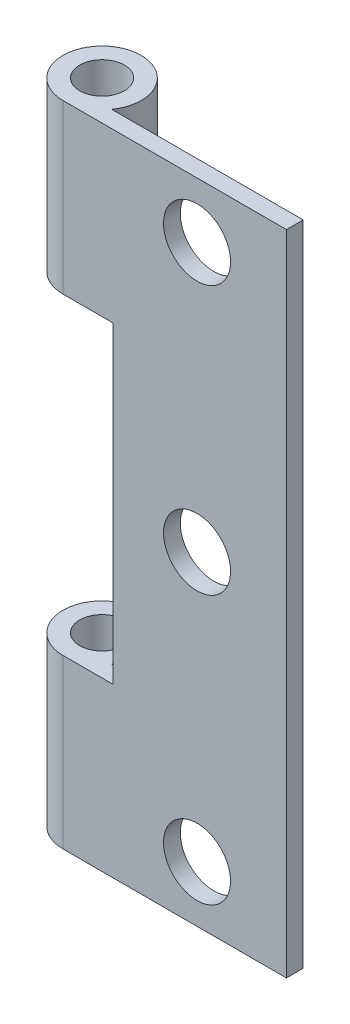
ISO-10303-21;
HEADER;
FILE_DESCRIPTION(('STEP AP214'),'2;1');
FILE_NAME('part.step','',(''),(''),'','','');
FILE_SCHEMA(('AUTOMOTIVE_DESIGN { 1 0 10303 214 1 1 1 1 }'));
ENDSEC;
DATA;
#1=APPLICATION_CONTEXT('core data for automotive mechanical design processes');
#2=APPLICATION_PROTOCOL_DEFINITION('international standard','automotive_design',2000,#1);
#3=PRODUCT_CONTEXT('',#1,'mechanical');
#4=PRODUCT('Part','Part','',(#3));
#5=PRODUCT_RELATED_PRODUCT_CATEGORY('part','',(#4));
#6=PRODUCT_DEFINITION_FORMATION('','',#4);
#7=PRODUCT_DEFINITION_CONTEXT('part definition',#1,'design');
#8=PRODUCT_DEFINITION('design','',#6,#7);
#9=PRODUCT_DEFINITION_SHAPE('','',#8);
#10=(LENGTH_UNIT() NAMED_UNIT(*) SI_UNIT(.MILLI.,.METRE.));
#11=(NAMED_UNIT(*) PLANE_ANGLE_UNIT() SI_UNIT($,.RADIAN.));
#12=(NAMED_UNIT(*) SI_UNIT($,.STERADIAN.) SOLID_ANGLE_UNIT());
#13=UNCERTAINTY_MEASURE_WITH_UNIT(LENGTH_MEASURE(1.E-05),#10,'distance_accuracy_value','');
#14=(GEOMETRIC_REPRESENTATION_CONTEXT(3) GLOBAL_UNCERTAINTY_ASSIGNED_CONTEXT((#13)) GLOBAL_UNIT_ASSIGNED_CONTEXT((#10,
#11,#12)) REPRESENTATION_CONTEXT('',''));
#15=CARTESIAN_POINT('',(0.,0.,0.));
#16=DIRECTION('',(0.,0.,1.));
#17=DIRECTION('',(1.,0.,0.));
#18=AXIS2_PLACEMENT_3D('',#15,#16,#17);
#19=CARTESIAN_POINT('',(-7.9375,23.01875,-2.1828125));
#20=DIRECTION('',(0.,-1.,0.));
#21=DIRECTION('',(0.,0.,-1.));
#22=AXIS2_PLACEMENT_3D('',#19,#20,#21);
#23=CYLINDRICAL_SURFACE('',#22,2.778125);
#24=DIRECTION('',(0.,-1.,0.));
#25=VECTOR('',#24,1.);
#26=CARTESIAN_POINT('',(-5.65762669965522,23.01875,-0.5953125));
#27=LINE('',#26,#25);
#28=CARTESIAN_POINT('',(-5.65762669965522,11.1125,-0.595312499999999));
#29=VERTEX_POINT('',#28);
#30=CARTESIAN_POINT('',(-5.65762669965522,23.01875,-0.5953125));
#31=VERTEX_POINT('',#30);
#32=EDGE_CURVE('E41',#29,#31,#27,.F.);
#33=ORIENTED_EDGE('',*,*,#32,.F.);
#34=CARTESIAN_POINT('',(-7.9375,11.1125,-2.1828125));
#35=DIRECTION('',(0.,1.,0.));
#36=DIRECTION('',(0.,0.,1.));
#37=AXIS2_PLACEMENT_3D('',#34,#35,#36);
#38=CIRCLE('',#37,2.778125);
#39=CARTESIAN_POINT('',(-7.9375,11.1125,0.5953125));
#40=VERTEX_POINT('',#39);
#41=EDGE_CURVE('E49',#29,#40,#38,.T.);
#42=ORIENTED_EDGE('',*,*,#41,.T.);
#43=DIRECTION('',(0.,-1.,0.));
#44=VECTOR('',#43,1.);
#45=CARTESIAN_POINT('',(-7.9375,-23.01875,0.5953125));
#46=LINE('',#45,#44);
#47=CARTESIAN_POINT('',(-7.9375,23.01875,0.595312500000001));
#48=VERTEX_POINT('',#47);
#49=EDGE_CURVE('E121',#48,#40,#46,.T.);
#50=ORIENTED_EDGE('',*,*,#49,.F.);
#51=CARTESIAN_POINT('',(-7.9375,23.01875,-2.1828125));
#52=DIRECTION('',(0.,1.,0.));
#53=DIRECTION('',(0.,0.,1.));
#54=AXIS2_PLACEMENT_3D('',#51,#52,#53);
#55=CIRCLE('',#54,2.778125);
#56=EDGE_CURVE('E144',#31,#48,#55,.T.);
#57=ORIENTED_EDGE('',*,*,#56,.F.);
#58=EDGE_LOOP('',(#33,#42,#50,#57));
#59=FACE_BOUND('',#58,.T.);
#60=ADVANCED_FACE('F32',(#59),#23,.T.);
#61=CARTESIAN_POINT('',(-7.9375,23.01875,-2.1828125));
#62=DIRECTION('',(0.,-1.,0.));
#63=DIRECTION('',(0.,0.,-1.));
#64=AXIS2_PLACEMENT_3D('',#61,#62,#63);
#65=CYLINDRICAL_SURFACE('',#64,1.5875);
#66=CARTESIAN_POINT('',(-7.9375,-11.1125,-2.1828125));
#67=DIRECTION('',(0.,-1.,0.));
#68=DIRECTION('',(0.,0.,-1.));
#69=AXIS2_PLACEMENT_3D('',#66,#67,#68);
#70=CIRCLE('',#69,1.5875);
#71=CARTESIAN_POINT('',(-7.9375,-11.1125,-3.7703125));
#72=VERTEX_POINT('',#71);
#73=EDGE_CURVE('E36',#72,#72,#70,.T.);
#74=ORIENTED_EDGE('',*,*,#73,.F.);
#75=EDGE_LOOP('',(#74));
#76=FACE_BOUND('',#75,.T.);
#77=CARTESIAN_POINT('',(-7.9375,-23.01875,-2.1828125));
#78=DIRECTION('',(0.,1.,0.));
#79=DIRECTION('',(0.,0.,1.));
#80=AXIS2_PLACEMENT_3D('',#77,#78,#79);
#81=CIRCLE('',#80,1.5875);
#82=CARTESIAN_POINT('',(-7.9375,-23.01875,-0.595312499999998));
#83=VERTEX_POINT('',#82);
#84=EDGE_CURVE('E137',#83,#83,#81,.T.);
#85=ORIENTED_EDGE('',*,*,#84,.F.);
#86=EDGE_LOOP('',(#85));
#87=FACE_BOUND('',#86,.T.);
#88=ADVANCED_FACE('F180',(#76,#87),#65,.F.);
#89=CARTESIAN_POINT('',(0.,0.,-0.5953125));
#90=DIRECTION('',(0.,0.,-1.));
#91=DIRECTION('',(-1.,0.,0.));
#92=AXIS2_PLACEMENT_3D('',#89,#90,#91);
#93=PLANE('',#92);
#94=CARTESIAN_POINT('',(1.5875,-19.05,-0.5953125));
#95=DIRECTION('',(0.,0.,-1.));
#96=DIRECTION('',(-1.,0.,0.));
#97=AXIS2_PLACEMENT_3D('',#94,#95,#96);
#98=CIRCLE('',#97,2.38125);
#99=CARTESIAN_POINT('',(-0.793749999999996,-19.05,-0.5953125));
#100=VERTEX_POINT('',#99);
#101=EDGE_CURVE('E228',#100,#100,#98,.T.);
#102=ORIENTED_EDGE('',*,*,#101,.F.);
#103=EDGE_LOOP('',(#102));
#104=FACE_BOUND('',#103,.T.);
#105=CARTESIAN_POINT('',(1.5875,0.,-0.5953125));
#106=DIRECTION('',(0.,0.,-1.));
#107=DIRECTION('',(-1.,0.,0.));
#108=AXIS2_PLACEMENT_3D('',#105,#106,#107);
#109=CIRCLE('',#108,2.38125);
#110=CARTESIAN_POINT('',(-0.793749999999996,0.,-0.5953125));
#111=VERTEX_POINT('',#110);
#112=EDGE_CURVE('E232',#111,#111,#109,.T.);
#113=ORIENTED_EDGE('',*,*,#112,.F.);
#114=EDGE_LOOP('',(#113));
#115=FACE_BOUND('',#114,.T.);
#116=CARTESIAN_POINT('',(1.5875,19.05,-0.5953125));
#117=DIRECTION('',(0.,0.,-1.));
#118=DIRECTION('',(-1.,0.,0.));
#119=AXIS2_PLACEMENT_3D('',#116,#117,#118);
#120=CIRCLE('',#119,2.38125);
#121=CARTESIAN_POINT('',(-0.793749999999996,19.05,-0.5953125));
#122=VERTEX_POINT('',#121);
#123=EDGE_CURVE('E235',#122,#122,#120,.T.);
#124=ORIENTED_EDGE('',*,*,#123,.F.);
#125=EDGE_LOOP('',(#124));
#126=FACE_BOUND('',#125,.T.);
#127=DIRECTION('',(-1.,0.,0.));
#128=VECTOR('',#127,1.);
#129=CARTESIAN_POINT('',(0.,-11.1125,-0.5953125));
#130=LINE('',#129,#128);
#131=CARTESIAN_POINT('',(-4.36562499999999,-11.1125,-0.5953125));
#132=VERTEX_POINT('',#131);
#133=CARTESIAN_POINT('',(-5.65762669965522,-11.1125,-0.595312499999999));
#134=VERTEX_POINT('',#133);
#135=EDGE_CURVE('E132',#132,#134,#130,.T.);
#136=ORIENTED_EDGE('',*,*,#135,.F.);
#137=DIRECTION('',(0.,-1.,0.));
#138=VECTOR('',#137,1.);
#139=CARTESIAN_POINT('',(-4.365625,0.,-0.5953125));
#140=LINE('',#139,#138);
#141=CARTESIAN_POINT('',(-4.365625,11.1125,-0.5953125));
#142=VERTEX_POINT('',#141);
#143=EDGE_CURVE('E135',#142,#132,#140,.T.);
#144=ORIENTED_EDGE('',*,*,#143,.F.);
#145=DIRECTION('',(1.,0.,0.));
#146=VECTOR('',#145,1.);
#147=CARTESIAN_POINT('',(0.,11.1125,-0.5953125));
#148=LINE('',#147,#146);
#149=EDGE_CURVE('E104',#29,#142,#148,.T.);
#150=ORIENTED_EDGE('',*,*,#149,.F.);
#151=ORIENTED_EDGE('',*,*,#32,.T.);
#152=DIRECTION('',(-1.,0.,0.));
#153=VECTOR('',#152,1.);
#154=CARTESIAN_POINT('',(-7.9375,23.01875,-0.5953125));
#155=LINE('',#154,#153);
#156=CARTESIAN_POINT('',(7.9375,23.01875,-0.5953125));
#157=VERTEX_POINT('',#156);
#158=EDGE_CURVE('E163',#157,#31,#155,.T.);
#159=ORIENTED_EDGE('',*,*,#158,.F.);
#160=DIRECTION('',(0.,1.,0.));
#161=VECTOR('',#160,1.);
#162=CARTESIAN_POINT('',(7.9375,-23.01875,-0.5953125));
#163=LINE('',#162,#161);
#164=CARTESIAN_POINT('',(7.9375,-23.01875,-0.5953125));
#165=VERTEX_POINT('',#164);
#166=EDGE_CURVE('E147',#165,#157,#163,.T.);
#167=ORIENTED_EDGE('',*,*,#166,.F.);
#168=DIRECTION('',(1.,0.,0.));
#169=VECTOR('',#168,1.);
#170=CARTESIAN_POINT('',(-7.9375,-23.01875,-0.5953125));
#171=LINE('',#170,#169);
#172=CARTESIAN_POINT('',(-5.65762669965522,-23.01875,-0.595312499999999));
#173=VERTEX_POINT('',#172);
#174=EDGE_CURVE('E154',#173,#165,#171,.T.);
#175=ORIENTED_EDGE('',*,*,#174,.F.);
#176=EDGE_CURVE('E11',#173,#134,#27,.F.);
#177=ORIENTED_EDGE('',*,*,#176,.T.);
#178=EDGE_LOOP('',(#136,#144,#150,#151,#159,#167,#175,#177));
#179=FACE_BOUND('',#178,.T.);
#180=ADVANCED_FACE('F193',(#104,#115,#126,#179),#93,.T.);
#181=CARTESIAN_POINT('',(7.9375,-23.01875,0.5953125));
#182=DIRECTION('',(-1.,0.,0.));
#183=DIRECTION('',(0.,0.,1.));
#184=AXIS2_PLACEMENT_3D('',#181,#182,#183);
#185=PLANE('',#184);
#186=ORIENTED_EDGE('',*,*,#166,.T.);
#187=DIRECTION('',(0.,0.,-1.));
#188=VECTOR('',#187,1.);
#189=CARTESIAN_POINT('',(7.9375,23.01875,0.5953125));
#190=LINE('',#189,#188);
#191=CARTESIAN_POINT('',(7.9375,23.01875,0.5953125));
#192=VERTEX_POINT('',#191);
#193=EDGE_CURVE('E169',#192,#157,#190,.T.);
#194=ORIENTED_EDGE('',*,*,#193,.F.);
#195=DIRECTION('',(0.,1.,0.));
#196=VECTOR('',#195,1.);
#197=CARTESIAN_POINT('',(7.9375,-23.01875,0.5953125));
#198=LINE('',#197,#196);
#199=CARTESIAN_POINT('',(7.9375,-23.01875,0.5953125));
#200=VERTEX_POINT('',#199);
#201=EDGE_CURVE('E150',#200,#192,#198,.T.);
#202=ORIENTED_EDGE('',*,*,#201,.F.);
#203=DIRECTION('',(0.,0.,-1.));
#204=VECTOR('',#203,1.);
#205=CARTESIAN_POINT('',(7.9375,-23.01875,0.5953125));
#206=LINE('',#205,#204);
#207=EDGE_CURVE('E160',#200,#165,#206,.T.);
#208=ORIENTED_EDGE('',*,*,#207,.T.);
#209=EDGE_LOOP('',(#186,#194,#202,#208));
#210=FACE_BOUND('',#209,.T.);
#211=ADVANCED_FACE('F34',(#210),#185,.F.);
#212=CARTESIAN_POINT('',(-7.9375,23.01875,0.5953125));
#213=DIRECTION('',(0.,-1.,0.));
#214=DIRECTION('',(0.,0.,-1.));
#215=AXIS2_PLACEMENT_3D('',#212,#213,#214);
#216=PLANE('',#215);
#217=ORIENTED_EDGE('',*,*,#158,.T.);
#218=ORIENTED_EDGE('',*,*,#56,.T.);
#219=DIRECTION('',(-1.,0.,0.));
#220=VECTOR('',#219,1.);
#221=CARTESIAN_POINT('',(-7.9375,23.01875,0.5953125));
#222=LINE('',#221,#220);
#223=EDGE_CURVE('E153',#192,#48,#222,.T.);
#224=ORIENTED_EDGE('',*,*,#223,.F.);
#225=ORIENTED_EDGE('',*,*,#193,.T.);
#226=EDGE_LOOP('',(#217,#218,#224,#225));
#227=FACE_BOUND('',#226,.T.);
#228=CARTESIAN_POINT('',(-7.9375,23.01875,-2.1828125));
#229=DIRECTION('',(0.,1.,0.));
#230=DIRECTION('',(0.,0.,1.));
#231=AXIS2_PLACEMENT_3D('',#228,#229,#230);
#232=CIRCLE('',#231,1.5875);
#233=CARTESIAN_POINT('',(-7.9375,23.01875,-0.595312499999998));
#234=VERTEX_POINT('',#233);
#235=EDGE_CURVE('E138',#234,#234,#232,.T.);
#236=ORIENTED_EDGE('',*,*,#235,.F.);
#237=EDGE_LOOP('',(#236));
#238=FACE_BOUND('',#237,.T.);
#239=ADVANCED_FACE('F183',(#227,#238),#216,.F.);
#240=CARTESIAN_POINT('',(-7.9375,-23.01875,0.5953125));
#241=DIRECTION('',(0.,1.,0.));
#242=DIRECTION('',(0.,0.,1.));
#243=AXIS2_PLACEMENT_3D('',#240,#241,#242);
#244=PLANE('',#243);
#245=ORIENTED_EDGE('',*,*,#84,.T.);
#246=EDGE_LOOP('',(#245));
#247=FACE_BOUND('',#246,.T.);
#248=DIRECTION('',(1.,0.,0.));
#249=VECTOR('',#248,1.);
#250=CARTESIAN_POINT('',(-7.9375,-23.01875,0.5953125));
#251=LINE('',#250,#249);
#252=CARTESIAN_POINT('',(-7.9375,-23.01875,0.595312500000001));
#253=VERTEX_POINT('',#252);
#254=EDGE_CURVE('E158',#253,#200,#251,.T.);
#255=ORIENTED_EDGE('',*,*,#254,.F.);
#256=CARTESIAN_POINT('',(-7.9375,-23.01875,-2.1828125));
#257=DIRECTION('',(0.,1.,0.));
#258=DIRECTION('',(0.,0.,1.));
#259=AXIS2_PLACEMENT_3D('',#256,#257,#258);
#260=CIRCLE('',#259,2.778125);
#261=EDGE_CURVE('E141',#173,#253,#260,.T.);
#262=ORIENTED_EDGE('',*,*,#261,.F.);
#263=ORIENTED_EDGE('',*,*,#174,.T.);
#264=ORIENTED_EDGE('',*,*,#207,.F.);
#265=EDGE_LOOP('',(#255,#262,#263,#264));
#266=FACE_BOUND('',#265,.T.);
#267=ADVANCED_FACE('F185',(#247,#266),#244,.F.);
#268=CARTESIAN_POINT('',(0.,0.,0.5953125));
#269=DIRECTION('',(0.,0.,-1.));
#270=DIRECTION('',(-1.,0.,0.));
#271=AXIS2_PLACEMENT_3D('',#268,#269,#270);
#272=PLANE('',#271);
#273=CARTESIAN_POINT('',(1.5875,-19.05,0.595312500000001));
#274=DIRECTION('',(0.,0.,-1.));
#275=DIRECTION('',(-1.,0.,0.));
#276=AXIS2_PLACEMENT_3D('',#273,#274,#275);
#277=CIRCLE('',#276,2.38125);
#278=CARTESIAN_POINT('',(-0.793749999999996,-19.05,0.595312500000001));
#279=VERTEX_POINT('',#278);
#280=EDGE_CURVE('E244',#279,#279,#277,.T.);
#281=ORIENTED_EDGE('',*,*,#280,.T.);
#282=EDGE_LOOP('',(#281));
#283=FACE_BOUND('',#282,.T.);
#284=CARTESIAN_POINT('',(1.5875,0.,0.595312500000001));
#285=DIRECTION('',(0.,0.,-1.));
#286=DIRECTION('',(-1.,0.,0.));
#287=AXIS2_PLACEMENT_3D('',#284,#285,#286);
#288=CIRCLE('',#287,2.38125);
#289=CARTESIAN_POINT('',(-0.793749999999996,0.,0.595312500000001));
#290=VERTEX_POINT('',#289);
#291=EDGE_CURVE('E237',#290,#290,#288,.T.);
#292=ORIENTED_EDGE('',*,*,#291,.T.);
#293=EDGE_LOOP('',(#292));
#294=FACE_BOUND('',#293,.T.);
#295=CARTESIAN_POINT('',(1.5875,19.05,0.595312500000001));
#296=DIRECTION('',(0.,0.,-1.));
#297=DIRECTION('',(-1.,0.,0.));
#298=AXIS2_PLACEMENT_3D('',#295,#296,#297);
#299=CIRCLE('',#298,2.38125);
#300=CARTESIAN_POINT('',(-0.793749999999996,19.05,0.595312500000001));
#301=VERTEX_POINT('',#300);
#302=EDGE_CURVE('E117',#301,#301,#299,.T.);
#303=ORIENTED_EDGE('',*,*,#302,.T.);
#304=EDGE_LOOP('',(#303));
#305=FACE_BOUND('',#304,.T.);
#306=DIRECTION('',(0.,1.,0.));
#307=VECTOR('',#306,1.);
#308=CARTESIAN_POINT('',(-4.365625,11.1125,0.595312500000001));
#309=LINE('',#308,#307);
#310=CARTESIAN_POINT('',(-4.36562499999999,-11.1125,0.595312500000001));
#311=VERTEX_POINT('',#310);
#312=CARTESIAN_POINT('',(-4.365625,11.1125,0.595312500000001));
#313=VERTEX_POINT('',#312);
#314=EDGE_CURVE('E112',#311,#313,#309,.T.);
#315=ORIENTED_EDGE('',*,*,#314,.F.);
#316=DIRECTION('',(1.,0.,0.));
#317=VECTOR('',#316,1.);
#318=CARTESIAN_POINT('',(-10.715625,-11.1125,0.595312500000001));
#319=LINE('',#318,#317);
#320=CARTESIAN_POINT('',(-7.9375,-11.1125,0.595312500000001));
#321=VERTEX_POINT('',#320);
#322=EDGE_CURVE('E108',#321,#311,#319,.T.);
#323=ORIENTED_EDGE('',*,*,#322,.F.);
#324=EDGE_CURVE('E156',#321,#253,#46,.T.);
#325=ORIENTED_EDGE('',*,*,#324,.T.);
#326=ORIENTED_EDGE('',*,*,#254,.T.);
#327=ORIENTED_EDGE('',*,*,#201,.T.);
#328=ORIENTED_EDGE('',*,*,#223,.T.);
#329=ORIENTED_EDGE('',*,*,#49,.T.);
#330=DIRECTION('',(-1.,0.,0.));
#331=VECTOR('',#330,1.);
#332=CARTESIAN_POINT('',(-10.715625,11.1125,0.595312500000001));
#333=LINE('',#332,#331);
#334=EDGE_CURVE('E102',#313,#40,#333,.T.);
#335=ORIENTED_EDGE('',*,*,#334,.F.);
#336=EDGE_LOOP('',(#315,#323,#325,#326,#327,#328,#329,#335));
#337=FACE_BOUND('',#336,.T.);
#338=ADVANCED_FACE('F119',(#283,#294,#305,#337),#272,.F.);
#339=CARTESIAN_POINT('',(-7.9375,-11.1125,-2.1828125));
#340=DIRECTION('',(0.,-1.,0.));
#341=DIRECTION('',(0.,0.,-1.));
#342=AXIS2_PLACEMENT_3D('',#339,#340,#341);
#343=CIRCLE('',#342,2.778125);
#344=EDGE_CURVE('E130',#321,#134,#343,.T.);
#345=ORIENTED_EDGE('',*,*,#344,.T.);
#346=ORIENTED_EDGE('',*,*,#176,.F.);
#347=ORIENTED_EDGE('',*,*,#261,.T.);
#348=ORIENTED_EDGE('',*,*,#324,.F.);
#349=EDGE_LOOP('',(#345,#346,#347,#348));
#350=FACE_BOUND('',#349,.T.);
#351=ADVANCED_FACE('F178',(#350),#23,.T.);
#352=CARTESIAN_POINT('',(-7.9375,11.1125,-2.1828125));
#353=DIRECTION('',(0.,1.,0.));
#354=DIRECTION('',(0.,0.,1.));
#355=AXIS2_PLACEMENT_3D('',#352,#353,#354);
#356=CIRCLE('',#355,1.5875);
#357=CARTESIAN_POINT('',(-7.9375,11.1125,-0.595312499999998));
#358=VERTEX_POINT('',#357);
#359=EDGE_CURVE('E126',#358,#358,#356,.T.);
#360=ORIENTED_EDGE('',*,*,#359,.F.);
#361=EDGE_LOOP('',(#360));
#362=FACE_BOUND('',#361,.T.);
#363=ORIENTED_EDGE('',*,*,#235,.T.);
#364=EDGE_LOOP('',(#363));
#365=FACE_BOUND('',#364,.T.);
#366=ADVANCED_FACE('F174',(#362,#365),#65,.F.);
#367=CARTESIAN_POINT('',(-10.715625,-11.1125,-4.9609375));
#368=DIRECTION('',(0.,-1.,0.));
#369=DIRECTION('',(0.,0.,-1.));
#370=AXIS2_PLACEMENT_3D('',#367,#368,#369);
#371=PLANE('',#370);
#372=ORIENTED_EDGE('',*,*,#135,.T.);
#373=ORIENTED_EDGE('',*,*,#344,.F.);
#374=ORIENTED_EDGE('',*,*,#322,.T.);
#375=DIRECTION('',(0.,0.,1.));
#376=VECTOR('',#375,1.);
#377=CARTESIAN_POINT('',(-4.36562499999999,-11.1125,-4.9609375));
#378=LINE('',#377,#376);
#379=EDGE_CURVE('E107',#132,#311,#378,.T.);
#380=ORIENTED_EDGE('',*,*,#379,.F.);
#381=EDGE_LOOP('',(#372,#373,#374,#380));
#382=FACE_BOUND('',#381,.T.);
#383=ORIENTED_EDGE('',*,*,#73,.T.);
#384=EDGE_LOOP('',(#383));
#385=FACE_BOUND('',#384,.T.);
#386=ADVANCED_FACE('F177',(#382,#385),#371,.F.);
#387=CARTESIAN_POINT('',(-10.715625,11.1125,-4.9609375));
#388=DIRECTION('',(0.,1.,0.));
#389=DIRECTION('',(0.,0.,1.));
#390=AXIS2_PLACEMENT_3D('',#387,#388,#389);
#391=PLANE('',#390);
#392=ORIENTED_EDGE('',*,*,#149,.T.);
#393=DIRECTION('',(0.,0.,1.));
#394=VECTOR('',#393,1.);
#395=CARTESIAN_POINT('',(-4.365625,11.1125,-4.9609375));
#396=LINE('',#395,#394);
#397=EDGE_CURVE('E97',#142,#313,#396,.T.);
#398=ORIENTED_EDGE('',*,*,#397,.T.);
#399=ORIENTED_EDGE('',*,*,#334,.T.);
#400=ORIENTED_EDGE('',*,*,#41,.F.);
#401=EDGE_LOOP('',(#392,#398,#399,#400));
#402=FACE_BOUND('',#401,.T.);
#403=ORIENTED_EDGE('',*,*,#359,.T.);
#404=EDGE_LOOP('',(#403));
#405=FACE_BOUND('',#404,.T.);
#406=ADVANCED_FACE('F99',(#402,#405),#391,.F.);
#407=CARTESIAN_POINT('',(-4.365625,11.1125,-4.9609375));
#408=DIRECTION('',(1.,0.,0.));
#409=DIRECTION('',(0.,1.,0.));
#410=AXIS2_PLACEMENT_3D('',#407,#408,#409);
#411=PLANE('',#410);
#412=ORIENTED_EDGE('',*,*,#143,.T.);
#413=ORIENTED_EDGE('',*,*,#379,.T.);
#414=ORIENTED_EDGE('',*,*,#314,.T.);
#415=ORIENTED_EDGE('',*,*,#397,.F.);
#416=EDGE_LOOP('',(#412,#413,#414,#415));
#417=FACE_BOUND('',#416,.T.);
#418=ADVANCED_FACE('F113',(#417),#411,.F.);
#419=CARTESIAN_POINT('',(1.5875,19.05,-0.5953125));
#420=DIRECTION('',(0.,0.,-1.));
#421=DIRECTION('',(-1.,0.,0.));
#422=AXIS2_PLACEMENT_3D('',#419,#420,#421);
#423=CYLINDRICAL_SURFACE('',#422,2.38125);
#424=ORIENTED_EDGE('',*,*,#302,.F.);
#425=EDGE_LOOP('',(#424));
#426=FACE_BOUND('',#425,.T.);
#427=ORIENTED_EDGE('',*,*,#123,.T.);
#428=EDGE_LOOP('',(#427));
#429=FACE_BOUND('',#428,.T.);
#430=ADVANCED_FACE('F256',(#426,#429),#423,.F.);
#431=CARTESIAN_POINT('',(1.5875,0.,-0.5953125));
#432=DIRECTION('',(0.,0.,-1.));
#433=DIRECTION('',(-1.,0.,0.));
#434=AXIS2_PLACEMENT_3D('',#431,#432,#433);
#435=CYLINDRICAL_SURFACE('',#434,2.38125);
#436=ORIENTED_EDGE('',*,*,#291,.F.);
#437=EDGE_LOOP('',(#436));
#438=FACE_BOUND('',#437,.T.);
#439=ORIENTED_EDGE('',*,*,#112,.T.);
#440=EDGE_LOOP('',(#439));
#441=FACE_BOUND('',#440,.T.);
#442=ADVANCED_FACE('F250',(#438,#441),#435,.F.);
#443=CARTESIAN_POINT('',(1.5875,-19.05,-0.5953125));
#444=DIRECTION('',(0.,0.,-1.));
#445=DIRECTION('',(-1.,0.,0.));
#446=AXIS2_PLACEMENT_3D('',#443,#444,#445);
#447=CYLINDRICAL_SURFACE('',#446,2.38125);
#448=ORIENTED_EDGE('',*,*,#280,.F.);
#449=EDGE_LOOP('',(#448));
#450=FACE_BOUND('',#449,.T.);
#451=ORIENTED_EDGE('',*,*,#101,.T.);
#452=EDGE_LOOP('',(#451));
#453=FACE_BOUND('',#452,.T.);
#454=ADVANCED_FACE('F248',(#450,#453),#447,.F.);
#455=CLOSED_SHELL('',(#60,#88,#180,#211,#239,#267,#338,#351,#366,#386,#406,#418,#430,#442,#454));
#456=MANIFOLD_SOLID_BREP('B2',#455);
#457=ADVANCED_BREP_SHAPE_REPRESENTATION('',(#18,#456),#14);
#458=SHAPE_DEFINITION_REPRESENTATION(#9,#457);
ENDSEC;
END-ISO-10303-21;
